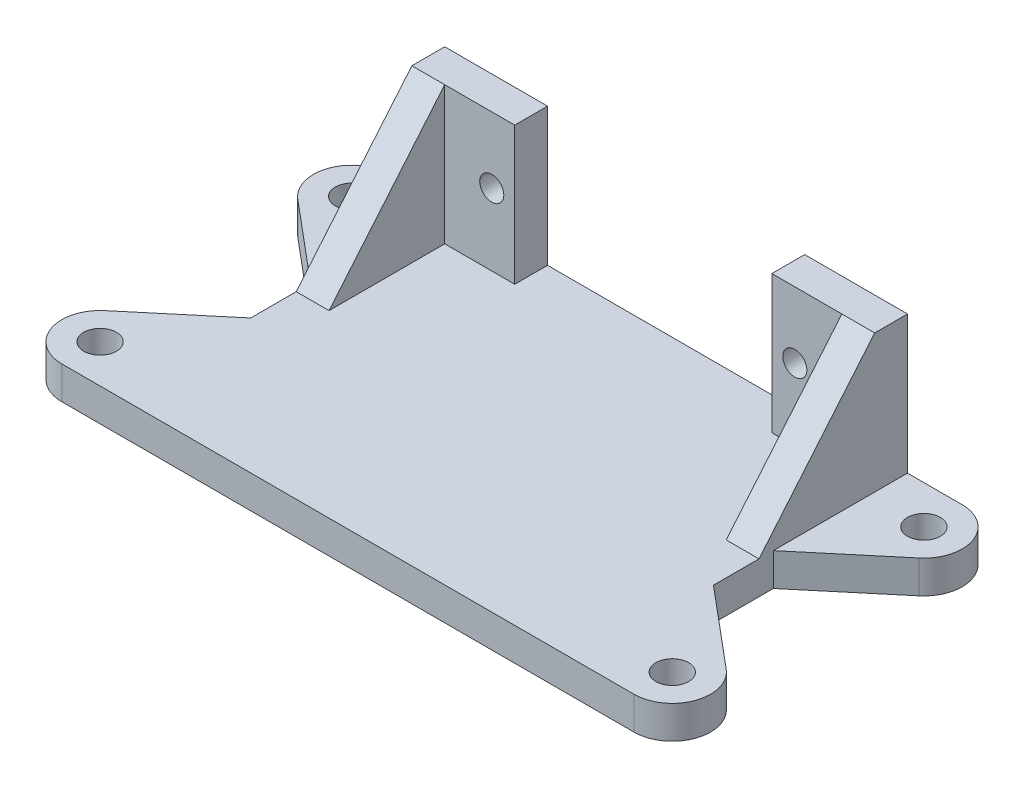
ISO-10303-21;
HEADER;
FILE_DESCRIPTION(('STEP AP214'),'2;1');
FILE_NAME('part.step','',(''),(''),'','','');
FILE_SCHEMA(('AUTOMOTIVE_DESIGN { 1 0 10303 214 1 1 1 1 }'));
ENDSEC;
DATA;
#1=APPLICATION_CONTEXT('core data for automotive mechanical design processes');
#2=APPLICATION_PROTOCOL_DEFINITION('international standard','automotive_design',2000,#1);
#3=PRODUCT_CONTEXT('',#1,'mechanical');
#4=PRODUCT('Part','Part','',(#3));
#5=PRODUCT_RELATED_PRODUCT_CATEGORY('part','',(#4));
#6=PRODUCT_DEFINITION_FORMATION('','',#4);
#7=PRODUCT_DEFINITION_CONTEXT('part definition',#1,'design');
#8=PRODUCT_DEFINITION('design','',#6,#7);
#9=PRODUCT_DEFINITION_SHAPE('','',#8);
#10=(LENGTH_UNIT() NAMED_UNIT(*) SI_UNIT(.MILLI.,.METRE.));
#11=(NAMED_UNIT(*) PLANE_ANGLE_UNIT() SI_UNIT($,.RADIAN.));
#12=(NAMED_UNIT(*) SI_UNIT($,.STERADIAN.) SOLID_ANGLE_UNIT());
#13=UNCERTAINTY_MEASURE_WITH_UNIT(LENGTH_MEASURE(1.E-05),#10,'distance_accuracy_value','');
#14=(GEOMETRIC_REPRESENTATION_CONTEXT(3) GLOBAL_UNCERTAINTY_ASSIGNED_CONTEXT((#13)) GLOBAL_UNIT_ASSIGNED_CONTEXT((#10,
#11,#12)) REPRESENTATION_CONTEXT('',''));
#15=CARTESIAN_POINT('',(0.,0.,0.));
#16=DIRECTION('',(0.,0.,1.));
#17=DIRECTION('',(1.,0.,0.));
#18=AXIS2_PLACEMENT_3D('',#15,#16,#17);
#19=CARTESIAN_POINT('',(21.15,15.6,3.));
#20=DIRECTION('',(1.,0.,0.));
#21=DIRECTION('',(0.,1.,0.));
#22=AXIS2_PLACEMENT_3D('',#19,#20,#21);
#23=PLANE('',#22);
#24=DIRECTION('',(0.,-1.,0.));
#25=VECTOR('',#24,1.);
#26=CARTESIAN_POINT('',(21.15,17.9220001314058,12.2644236685494));
#27=LINE('',#26,#25);
#28=CARTESIAN_POINT('',(21.15,2.99999999999999,12.2644236685494));
#29=VERTEX_POINT('',#28);
#30=CARTESIAN_POINT('',(21.15,0.,12.2644236685494));
#31=VERTEX_POINT('',#30);
#32=EDGE_CURVE('E203',#29,#31,#27,.T.);
#33=ORIENTED_EDGE('',*,*,#32,.F.);
#34=DIRECTION('',(0.,0.,-1.));
#35=VECTOR('',#34,1.);
#36=CARTESIAN_POINT('',(21.15,2.99999999999999,0.));
#37=LINE('',#36,#35);
#38=CARTESIAN_POINT('',(21.15,2.99999999999999,0.));
#39=VERTEX_POINT('',#38);
#40=EDGE_CURVE('E225',#29,#39,#37,.T.);
#41=ORIENTED_EDGE('',*,*,#40,.T.);
#42=DIRECTION('',(0.,-1.,0.));
#43=VECTOR('',#42,1.);
#44=CARTESIAN_POINT('',(21.15,15.6,0.));
#45=LINE('',#44,#43);
#46=CARTESIAN_POINT('',(21.15,15.6,0.));
#47=VERTEX_POINT('',#46);
#48=EDGE_CURVE('E218',#47,#39,#45,.T.);
#49=ORIENTED_EDGE('',*,*,#48,.F.);
#50=DIRECTION('',(0.,0.,-1.));
#51=VECTOR('',#50,1.);
#52=CARTESIAN_POINT('',(21.15,15.6,3.));
#53=LINE('',#52,#51);
#54=CARTESIAN_POINT('',(21.15,15.6,3.));
#55=VERTEX_POINT('',#54);
#56=EDGE_CURVE('E38',#55,#47,#53,.T.);
#57=ORIENTED_EDGE('',*,*,#56,.F.);
#58=DIRECTION('',(0.,-0.766044443118982,0.642787609686535));
#59=VECTOR('',#58,1.);
#60=CARTESIAN_POINT('',(21.15,15.6,3.));
#61=LINE('',#60,#59);
#62=CARTESIAN_POINT('',(21.15,2.99999999999999,13.5726553528336));
#63=VERTEX_POINT('',#62);
#64=EDGE_CURVE('E318',#55,#63,#61,.T.);
#65=ORIENTED_EDGE('',*,*,#64,.T.);
#66=DIRECTION('',(0.,0.,1.));
#67=VECTOR('',#66,1.);
#68=CARTESIAN_POINT('',(21.15,2.99999999999999,0.));
#69=LINE('',#68,#67);
#70=CARTESIAN_POINT('',(21.15,2.99999999999999,17.7355763314506));
#71=VERTEX_POINT('',#70);
#72=EDGE_CURVE('E348',#63,#71,#69,.T.);
#73=ORIENTED_EDGE('',*,*,#72,.T.);
#74=DIRECTION('',(0.,-1.,0.));
#75=VECTOR('',#74,1.);
#76=CARTESIAN_POINT('',(21.15,17.9220001314058,17.7355763314506));
#77=LINE('',#76,#75);
#78=CARTESIAN_POINT('',(21.15,0.,17.7355763314506));
#79=VERTEX_POINT('',#78);
#80=EDGE_CURVE('E243',#71,#79,#77,.T.);
#81=ORIENTED_EDGE('',*,*,#80,.T.);
#82=DIRECTION('',(0.,0.,-1.));
#83=VECTOR('',#82,1.);
#84=CARTESIAN_POINT('',(21.15,0.,3.));
#85=LINE('',#84,#83);
#86=EDGE_CURVE('E401',#79,#31,#85,.T.);
#87=ORIENTED_EDGE('',*,*,#86,.T.);
#88=EDGE_LOOP('',(#33,#41,#49,#57,#65,#73,#81,#87));
#89=FACE_BOUND('',#88,.T.);
#90=ADVANCED_FACE('F34',(#89),#23,.T.);
#91=CARTESIAN_POINT('',(-21.15,0.,3.));
#92=DIRECTION('',(-1.,0.,0.));
#93=DIRECTION('',(0.,-1.,0.));
#94=AXIS2_PLACEMENT_3D('',#91,#92,#93);
#95=PLANE('',#94);
#96=DIRECTION('',(0.,0.,-1.));
#97=VECTOR('',#96,1.);
#98=CARTESIAN_POINT('',(-21.15,2.99999999999999,0.));
#99=LINE('',#98,#97);
#100=CARTESIAN_POINT('',(-21.15,2.99999999999999,12.2644236685494));
#101=VERTEX_POINT('',#100);
#102=CARTESIAN_POINT('',(-21.15,2.99999999999999,0.));
#103=VERTEX_POINT('',#102);
#104=EDGE_CURVE('E59',#101,#103,#99,.T.);
#105=ORIENTED_EDGE('',*,*,#104,.F.);
#106=DIRECTION('',(0.,-1.,0.));
#107=VECTOR('',#106,1.);
#108=CARTESIAN_POINT('',(-21.15,17.9220001314058,12.2644236685494));
#109=LINE('',#108,#107);
#110=CARTESIAN_POINT('',(-21.15,0.,12.2644236685494));
#111=VERTEX_POINT('',#110);
#112=EDGE_CURVE('E269',#101,#111,#109,.T.);
#113=ORIENTED_EDGE('',*,*,#112,.T.);
#114=DIRECTION('',(0.,0.,-1.));
#115=VECTOR('',#114,1.);
#116=CARTESIAN_POINT('',(-21.15,0.,3.));
#117=LINE('',#116,#115);
#118=CARTESIAN_POINT('',(-21.15,0.,17.7355763314506));
#119=VERTEX_POINT('',#118);
#120=EDGE_CURVE('E399',#119,#111,#117,.T.);
#121=ORIENTED_EDGE('',*,*,#120,.F.);
#122=DIRECTION('',(0.,-1.,0.));
#123=VECTOR('',#122,1.);
#124=CARTESIAN_POINT('',(-21.15,17.9220001314058,17.7355763314506));
#125=LINE('',#124,#123);
#126=CARTESIAN_POINT('',(-21.15,2.99999999999999,17.7355763314506));
#127=VERTEX_POINT('',#126);
#128=EDGE_CURVE('E296',#127,#119,#125,.T.);
#129=ORIENTED_EDGE('',*,*,#128,.F.);
#130=DIRECTION('',(0.,0.,-1.));
#131=VECTOR('',#130,1.);
#132=CARTESIAN_POINT('',(-21.15,2.99999999999999,0.));
#133=LINE('',#132,#131);
#134=CARTESIAN_POINT('',(-21.15,2.99999999999999,13.5726553528336));
#135=VERTEX_POINT('',#134);
#136=EDGE_CURVE('E349',#127,#135,#133,.T.);
#137=ORIENTED_EDGE('',*,*,#136,.T.);
#138=DIRECTION('',(0.,-0.766044443118982,0.642787609686535));
#139=VECTOR('',#138,1.);
#140=CARTESIAN_POINT('',(-21.15,15.6,3.));
#141=LINE('',#140,#139);
#142=CARTESIAN_POINT('',(-21.15,15.6,3.));
#143=VERTEX_POINT('',#142);
#144=EDGE_CURVE('E293',#143,#135,#141,.T.);
#145=ORIENTED_EDGE('',*,*,#144,.F.);
#146=DIRECTION('',(0.,0.,-1.));
#147=VECTOR('',#146,1.);
#148=CARTESIAN_POINT('',(-21.15,15.6,3.));
#149=LINE('',#148,#147);
#150=CARTESIAN_POINT('',(-21.15,15.6,0.));
#151=VERTEX_POINT('',#150);
#152=EDGE_CURVE('E396',#143,#151,#149,.T.);
#153=ORIENTED_EDGE('',*,*,#152,.T.);
#154=DIRECTION('',(0.,1.,0.));
#155=VECTOR('',#154,1.);
#156=CARTESIAN_POINT('',(-21.15,0.,0.));
#157=LINE('',#156,#155);
#158=EDGE_CURVE('E378',#103,#151,#157,.T.);
#159=ORIENTED_EDGE('',*,*,#158,.F.);
#160=EDGE_LOOP('',(#105,#113,#121,#129,#137,#145,#153,#159));
#161=FACE_BOUND('',#160,.T.);
#162=ADVANCED_FACE('F463',(#161),#95,.T.);
#163=CARTESIAN_POINT('',(-11.75,2.99999999999999,3.));
#164=DIRECTION('',(0.,1.,0.));
#165=DIRECTION('',(0.,0.,1.));
#166=AXIS2_PLACEMENT_3D('',#163,#164,#165);
#167=PLANE('',#166);
#168=DIRECTION('',(0.,0.,-1.));
#169=VECTOR('',#168,1.);
#170=CARTESIAN_POINT('',(-18.15,2.99999999999999,13.5726553528336));
#171=LINE('',#170,#169);
#172=CARTESIAN_POINT('',(-18.15,2.99999999999999,13.5726553528336));
#173=VERTEX_POINT('',#172);
#174=CARTESIAN_POINT('',(-18.15,2.99999999999999,3.));
#175=VERTEX_POINT('',#174);
#176=EDGE_CURVE('E309',#173,#175,#171,.T.);
#177=ORIENTED_EDGE('',*,*,#176,.F.);
#178=DIRECTION('',(-1.,0.,0.));
#179=VECTOR('',#178,1.);
#180=CARTESIAN_POINT('',(-18.15,2.99999999999999,13.5726553528336));
#181=LINE('',#180,#179);
#182=EDGE_CURVE('E313',#173,#135,#181,.T.);
#183=ORIENTED_EDGE('',*,*,#182,.T.);
#184=ORIENTED_EDGE('',*,*,#136,.F.);
#185=DIRECTION('',(0.76604444311898,0.,-0.642787609686538));
#186=VECTOR('',#185,1.);
#187=CARTESIAN_POINT('',(-28.3997566339029,2.99999999999999,23.8188444490836));
#188=LINE('',#187,#186);
#189=CARTESIAN_POINT('',(-28.3997566339029,2.99999999999999,23.8188444490836));
#190=VERTEX_POINT('',#189);
#191=EDGE_CURVE('E273',#190,#127,#188,.T.);
#192=ORIENTED_EDGE('',*,*,#191,.F.);
#193=CARTESIAN_POINT('',(-26.15,2.99999999999999,26.5));
#194=DIRECTION('',(0.,1.,0.));
#195=DIRECTION('',(0.,0.,1.));
#196=AXIS2_PLACEMENT_3D('',#193,#194,#195);
#197=CIRCLE('',#196,3.5);
#198=CARTESIAN_POINT('',(-26.15,2.99999999999999,30.));
#199=VERTEX_POINT('',#198);
#200=EDGE_CURVE('E297',#199,#190,#197,.F.);
#201=ORIENTED_EDGE('',*,*,#200,.F.);
#202=DIRECTION('',(-1.,0.,0.));
#203=VECTOR('',#202,1.);
#204=CARTESIAN_POINT('',(-21.15,2.99999999999999,30.));
#205=LINE('',#204,#203);
#206=CARTESIAN_POINT('',(26.15,2.99999999999999,30.));
#207=VERTEX_POINT('',#206);
#208=EDGE_CURVE('E352',#207,#199,#205,.T.);
#209=ORIENTED_EDGE('',*,*,#208,.F.);
#210=CARTESIAN_POINT('',(26.15,2.99999999999999,26.5));
#211=DIRECTION('',(0.,1.,0.));
#212=DIRECTION('',(0.,0.,1.));
#213=AXIS2_PLACEMENT_3D('',#210,#211,#212);
#214=CIRCLE('',#213,3.5);
#215=CARTESIAN_POINT('',(28.3997566339029,2.99999999999999,23.8188444490836));
#216=VERTEX_POINT('',#215);
#217=EDGE_CURVE('E232',#207,#216,#214,.T.);
#218=ORIENTED_EDGE('',*,*,#217,.T.);
#219=DIRECTION('',(-0.76604444311898,0.,-0.642787609686538));
#220=VECTOR('',#219,1.);
#221=CARTESIAN_POINT('',(28.3997566339029,2.99999999999999,23.8188444490836));
#222=LINE('',#221,#220);
#223=EDGE_CURVE('E229',#216,#71,#222,.T.);
#224=ORIENTED_EDGE('',*,*,#223,.T.);
#225=ORIENTED_EDGE('',*,*,#72,.F.);
#226=DIRECTION('',(1.,0.,0.));
#227=VECTOR('',#226,1.);
#228=CARTESIAN_POINT('',(18.15,2.99999999999999,13.5726553528336));
#229=LINE('',#228,#227);
#230=CARTESIAN_POINT('',(18.15,2.99999999999999,13.5726553528336));
#231=VERTEX_POINT('',#230);
#232=EDGE_CURVE('E330',#231,#63,#229,.T.);
#233=ORIENTED_EDGE('',*,*,#232,.F.);
#234=DIRECTION('',(0.,0.,-1.));
#235=VECTOR('',#234,1.);
#236=CARTESIAN_POINT('',(18.15,2.99999999999999,13.5726553528336));
#237=LINE('',#236,#235);
#238=CARTESIAN_POINT('',(18.15,2.99999999999999,3.));
#239=VERTEX_POINT('',#238);
#240=EDGE_CURVE('E324',#231,#239,#237,.T.);
#241=ORIENTED_EDGE('',*,*,#240,.T.);
#242=DIRECTION('',(1.,0.,0.));
#243=VECTOR('',#242,1.);
#244=CARTESIAN_POINT('',(0.,2.99999999999999,3.));
#245=LINE('',#244,#243);
#246=CARTESIAN_POINT('',(11.75,2.99999999999999,3.));
#247=VERTEX_POINT('',#246);
#248=EDGE_CURVE('E351',#247,#239,#245,.T.);
#249=ORIENTED_EDGE('',*,*,#248,.F.);
#250=DIRECTION('',(0.,0.,-1.));
#251=VECTOR('',#250,1.);
#252=CARTESIAN_POINT('',(11.75,2.99999999999999,3.));
#253=LINE('',#252,#251);
#254=CARTESIAN_POINT('',(11.75,2.99999999999999,0.));
#255=VERTEX_POINT('',#254);
#256=EDGE_CURVE('E43',#247,#255,#253,.T.);
#257=ORIENTED_EDGE('',*,*,#256,.T.);
#258=DIRECTION('',(1.,0.,0.));
#259=VECTOR('',#258,1.);
#260=CARTESIAN_POINT('',(-11.75,2.99999999999999,0.));
#261=LINE('',#260,#259);
#262=CARTESIAN_POINT('',(-11.75,2.99999999999999,0.));
#263=VERTEX_POINT('',#262);
#264=EDGE_CURVE('E386',#263,#255,#261,.T.);
#265=ORIENTED_EDGE('',*,*,#264,.F.);
#266=DIRECTION('',(0.,0.,-1.));
#267=VECTOR('',#266,1.);
#268=CARTESIAN_POINT('',(-11.75,2.99999999999999,3.));
#269=LINE('',#268,#267);
#270=CARTESIAN_POINT('',(-11.75,2.99999999999999,3.));
#271=VERTEX_POINT('',#270);
#272=EDGE_CURVE('E392',#271,#263,#269,.T.);
#273=ORIENTED_EDGE('',*,*,#272,.F.);
#274=EDGE_CURVE('E358',#175,#271,#245,.T.);
#275=ORIENTED_EDGE('',*,*,#274,.F.);
#276=EDGE_LOOP('',(#177,#183,#184,#192,#201,#209,#218,#224,#225,#233,#241,#249,#257,#265,#273,#275));
#277=FACE_BOUND('',#276,.T.);
#278=CARTESIAN_POINT('',(-26.15,2.99999999999999,26.5));
#279=DIRECTION('',(0.,1.,0.));
#280=DIRECTION('',(0.,0.,1.));
#281=AXIS2_PLACEMENT_3D('',#278,#279,#280);
#282=CIRCLE('',#281,1.5);
#283=CARTESIAN_POINT('',(-26.15,2.99999999999999,28.));
#284=VERTEX_POINT('',#283);
#285=EDGE_CURVE('E283',#284,#284,#282,.F.);
#286=ORIENTED_EDGE('',*,*,#285,.T.);
#287=EDGE_LOOP('',(#286));
#288=FACE_BOUND('',#287,.T.);
#289=CARTESIAN_POINT('',(26.15,2.99999999999999,26.5));
#290=DIRECTION('',(0.,1.,0.));
#291=DIRECTION('',(0.,0.,1.));
#292=AXIS2_PLACEMENT_3D('',#289,#290,#291);
#293=CIRCLE('',#292,1.5);
#294=CARTESIAN_POINT('',(26.15,2.99999999999999,28.));
#295=VERTEX_POINT('',#294);
#296=EDGE_CURVE('E233',#295,#295,#293,.T.);
#297=ORIENTED_EDGE('',*,*,#296,.F.);
#298=EDGE_LOOP('',(#297));
#299=FACE_BOUND('',#298,.T.);
#300=ADVANCED_FACE('F425',(#277,#288,#299),#167,.T.);
#301=CARTESIAN_POINT('',(0.,0.,3.));
#302=DIRECTION('',(0.,0.,-1.));
#303=DIRECTION('',(-1.,0.,0.));
#304=AXIS2_PLACEMENT_3D('',#301,#302,#303);
#305=PLANE('',#304);
#306=CARTESIAN_POINT('',(-13.85,9.54999999999999,3.));
#307=DIRECTION('',(0.,0.,1.));
#308=DIRECTION('',(1.,0.,0.));
#309=AXIS2_PLACEMENT_3D('',#306,#307,#308);
#310=CIRCLE('',#309,1.1);
#311=CARTESIAN_POINT('',(-12.75,9.54999999999999,3.));
#312=VERTEX_POINT('',#311);
#313=EDGE_CURVE('E332',#312,#312,#310,.T.);
#314=ORIENTED_EDGE('',*,*,#313,.F.);
#315=EDGE_LOOP('',(#314));
#316=FACE_BOUND('',#315,.T.);
#317=DIRECTION('',(1.,0.,0.));
#318=VECTOR('',#317,1.);
#319=CARTESIAN_POINT('',(-21.15,15.6,3.));
#320=LINE('',#319,#318);
#321=CARTESIAN_POINT('',(-18.15,15.6,3.));
#322=VERTEX_POINT('',#321);
#323=CARTESIAN_POINT('',(-11.75,15.6,3.));
#324=VERTEX_POINT('',#323);
#325=EDGE_CURVE('E362',#322,#324,#320,.T.);
#326=ORIENTED_EDGE('',*,*,#325,.F.);
#327=DIRECTION('',(0.,1.,0.));
#328=VECTOR('',#327,1.);
#329=CARTESIAN_POINT('',(-18.15,2.99999999999999,3.));
#330=LINE('',#329,#328);
#331=EDGE_CURVE('E306',#175,#322,#330,.T.);
#332=ORIENTED_EDGE('',*,*,#331,.F.);
#333=ORIENTED_EDGE('',*,*,#274,.T.);
#334=DIRECTION('',(0.,-1.,0.));
#335=VECTOR('',#334,1.);
#336=CARTESIAN_POINT('',(-11.75,15.6,3.));
#337=LINE('',#336,#335);
#338=EDGE_CURVE('E367',#324,#271,#337,.T.);
#339=ORIENTED_EDGE('',*,*,#338,.F.);
#340=EDGE_LOOP('',(#326,#332,#333,#339));
#341=FACE_BOUND('',#340,.T.);
#342=ADVANCED_FACE('F457',(#316,#341),#305,.F.);
#343=CARTESIAN_POINT('',(11.75,15.6,3.));
#344=DIRECTION('',(0.,1.,0.));
#345=DIRECTION('',(0.,0.,1.));
#346=AXIS2_PLACEMENT_3D('',#343,#344,#345);
#347=PLANE('',#346);
#348=DIRECTION('',(1.,0.,0.));
#349=VECTOR('',#348,1.);
#350=CARTESIAN_POINT('',(11.75,15.6,0.));
#351=LINE('',#350,#349);
#352=CARTESIAN_POINT('',(11.75,15.6,0.));
#353=VERTEX_POINT('',#352);
#354=EDGE_CURVE('E373',#353,#47,#351,.T.);
#355=ORIENTED_EDGE('',*,*,#354,.F.);
#356=DIRECTION('',(0.,0.,-1.));
#357=VECTOR('',#356,1.);
#358=CARTESIAN_POINT('',(11.75,15.6,3.));
#359=LINE('',#358,#357);
#360=CARTESIAN_POINT('',(11.75,15.6,3.));
#361=VERTEX_POINT('',#360);
#362=EDGE_CURVE('E11',#361,#353,#359,.T.);
#363=ORIENTED_EDGE('',*,*,#362,.F.);
#364=DIRECTION('',(1.,0.,0.));
#365=VECTOR('',#364,1.);
#366=CARTESIAN_POINT('',(11.75,15.6,3.));
#367=LINE('',#366,#365);
#368=CARTESIAN_POINT('',(18.15,15.6,3.));
#369=VERTEX_POINT('',#368);
#370=EDGE_CURVE('E359',#361,#369,#367,.T.);
#371=ORIENTED_EDGE('',*,*,#370,.T.);
#372=DIRECTION('',(1.,0.,0.));
#373=VECTOR('',#372,1.);
#374=CARTESIAN_POINT('',(18.15,15.6,3.));
#375=LINE('',#374,#373);
#376=EDGE_CURVE('E327',#369,#55,#375,.T.);
#377=ORIENTED_EDGE('',*,*,#376,.T.);
#378=ORIENTED_EDGE('',*,*,#56,.T.);
#379=EDGE_LOOP('',(#355,#363,#371,#377,#378));
#380=FACE_BOUND('',#379,.T.);
#381=ADVANCED_FACE('F36',(#380),#347,.T.);
#382=CARTESIAN_POINT('',(11.75,2.99999999999999,3.));
#383=DIRECTION('',(-1.,0.,0.));
#384=DIRECTION('',(0.,0.,1.));
#385=AXIS2_PLACEMENT_3D('',#382,#383,#384);
#386=PLANE('',#385);
#387=DIRECTION('',(0.,1.,0.));
#388=VECTOR('',#387,1.);
#389=CARTESIAN_POINT('',(11.75,2.99999999999999,0.));
#390=LINE('',#389,#388);
#391=EDGE_CURVE('E363',#255,#353,#390,.T.);
#392=ORIENTED_EDGE('',*,*,#391,.F.);
#393=ORIENTED_EDGE('',*,*,#256,.F.);
#394=DIRECTION('',(0.,1.,0.));
#395=VECTOR('',#394,1.);
#396=CARTESIAN_POINT('',(11.75,2.99999999999999,3.));
#397=LINE('',#396,#395);
#398=EDGE_CURVE('E370',#247,#361,#397,.T.);
#399=ORIENTED_EDGE('',*,*,#398,.T.);
#400=ORIENTED_EDGE('',*,*,#362,.T.);
#401=EDGE_LOOP('',(#392,#393,#399,#400));
#402=FACE_BOUND('',#401,.T.);
#403=ADVANCED_FACE('F413',(#402),#386,.T.);
#404=CARTESIAN_POINT('',(-11.75,15.6,3.));
#405=DIRECTION('',(1.,0.,0.));
#406=DIRECTION('',(0.,0.,-1.));
#407=AXIS2_PLACEMENT_3D('',#404,#405,#406);
#408=PLANE('',#407);
#409=DIRECTION('',(0.,-1.,0.));
#410=VECTOR('',#409,1.);
#411=CARTESIAN_POINT('',(-11.75,15.6,0.));
#412=LINE('',#411,#410);
#413=CARTESIAN_POINT('',(-11.75,15.6,0.));
#414=VERTEX_POINT('',#413);
#415=EDGE_CURVE('E383',#414,#263,#412,.T.);
#416=ORIENTED_EDGE('',*,*,#415,.F.);
#417=DIRECTION('',(0.,0.,-1.));
#418=VECTOR('',#417,1.);
#419=CARTESIAN_POINT('',(-11.75,15.6,3.));
#420=LINE('',#419,#418);
#421=EDGE_CURVE('E394',#324,#414,#420,.T.);
#422=ORIENTED_EDGE('',*,*,#421,.F.);
#423=ORIENTED_EDGE('',*,*,#338,.T.);
#424=ORIENTED_EDGE('',*,*,#272,.T.);
#425=EDGE_LOOP('',(#416,#422,#423,#424));
#426=FACE_BOUND('',#425,.T.);
#427=ADVANCED_FACE('F458',(#426),#408,.T.);
#428=CARTESIAN_POINT('',(-21.15,15.6,3.));
#429=DIRECTION('',(0.,1.,0.));
#430=DIRECTION('',(0.,0.,1.));
#431=AXIS2_PLACEMENT_3D('',#428,#429,#430);
#432=PLANE('',#431);
#433=DIRECTION('',(1.,0.,0.));
#434=VECTOR('',#433,1.);
#435=CARTESIAN_POINT('',(-21.15,15.6,0.));
#436=LINE('',#435,#434);
#437=EDGE_CURVE('E380',#151,#414,#436,.T.);
#438=ORIENTED_EDGE('',*,*,#437,.F.);
#439=ORIENTED_EDGE('',*,*,#152,.F.);
#440=EDGE_CURVE('E364',#143,#322,#320,.T.);
#441=ORIENTED_EDGE('',*,*,#440,.T.);
#442=ORIENTED_EDGE('',*,*,#325,.T.);
#443=ORIENTED_EDGE('',*,*,#421,.T.);
#444=EDGE_LOOP('',(#438,#439,#441,#442,#443));
#445=FACE_BOUND('',#444,.T.);
#446=ADVANCED_FACE('F449',(#445),#432,.T.);
#447=CARTESIAN_POINT('',(21.15,0.,3.));
#448=DIRECTION('',(0.,-1.,0.));
#449=DIRECTION('',(0.,0.,-1.));
#450=AXIS2_PLACEMENT_3D('',#447,#448,#449);
#451=PLANE('',#450);
#452=DIRECTION('',(-1.,0.,0.));
#453=VECTOR('',#452,1.);
#454=CARTESIAN_POINT('',(21.15,0.,0.));
#455=LINE('',#454,#453);
#456=CARTESIAN_POINT('',(26.15,0.,0.));
#457=VERTEX_POINT('',#456);
#458=CARTESIAN_POINT('',(-26.15,0.,0.));
#459=VERTEX_POINT('',#458);
#460=EDGE_CURVE('E376',#457,#459,#455,.T.);
#461=ORIENTED_EDGE('',*,*,#460,.F.);
#462=CARTESIAN_POINT('',(26.15,0.,3.5));
#463=DIRECTION('',(0.,-1.,0.));
#464=DIRECTION('',(0.,0.,1.));
#465=AXIS2_PLACEMENT_3D('',#462,#463,#464);
#466=CIRCLE('',#465,3.5);
#467=CARTESIAN_POINT('',(28.3997566339029,0.,6.18115555091643));
#468=VERTEX_POINT('',#467);
#469=EDGE_CURVE('E210',#457,#468,#466,.T.);
#470=ORIENTED_EDGE('',*,*,#469,.T.);
#471=DIRECTION('',(-0.76604444311898,0.,0.642787609686538));
#472=VECTOR('',#471,1.);
#473=CARTESIAN_POINT('',(28.3997566339029,0.,6.18115555091643));
#474=LINE('',#473,#472);
#475=EDGE_CURVE('E437',#468,#31,#474,.T.);
#476=ORIENTED_EDGE('',*,*,#475,.T.);
#477=ORIENTED_EDGE('',*,*,#86,.F.);
#478=DIRECTION('',(-0.76604444311898,0.,-0.642787609686538));
#479=VECTOR('',#478,1.);
#480=CARTESIAN_POINT('',(28.3997566339029,0.,23.8188444490836));
#481=LINE('',#480,#479);
#482=CARTESIAN_POINT('',(28.3997566339029,0.,23.8188444490836));
#483=VERTEX_POINT('',#482);
#484=EDGE_CURVE('E51',#483,#79,#481,.T.);
#485=ORIENTED_EDGE('',*,*,#484,.F.);
#486=CARTESIAN_POINT('',(26.15,0.,26.5));
#487=DIRECTION('',(0.,1.,0.));
#488=DIRECTION('',(0.,0.,-1.));
#489=AXIS2_PLACEMENT_3D('',#486,#487,#488);
#490=CIRCLE('',#489,3.5);
#491=CARTESIAN_POINT('',(26.15,0.,30.));
#492=VERTEX_POINT('',#491);
#493=EDGE_CURVE('E240',#492,#483,#490,.T.);
#494=ORIENTED_EDGE('',*,*,#493,.F.);
#495=DIRECTION('',(-1.,0.,0.));
#496=VECTOR('',#495,1.);
#497=CARTESIAN_POINT('',(-21.15,0.,30.));
#498=LINE('',#497,#496);
#499=CARTESIAN_POINT('',(-26.15,0.,30.));
#500=VERTEX_POINT('',#499);
#501=EDGE_CURVE('E338',#492,#500,#498,.T.);
#502=ORIENTED_EDGE('',*,*,#501,.T.);
#503=CARTESIAN_POINT('',(-26.15,0.,26.5));
#504=DIRECTION('',(0.,-1.,0.));
#505=DIRECTION('',(0.,0.,-1.));
#506=AXIS2_PLACEMENT_3D('',#503,#504,#505);
#507=CIRCLE('',#506,3.5);
#508=CARTESIAN_POINT('',(-28.3997566339029,0.,23.8188444490836));
#509=VERTEX_POINT('',#508);
#510=EDGE_CURVE('E284',#500,#509,#507,.T.);
#511=ORIENTED_EDGE('',*,*,#510,.T.);
#512=DIRECTION('',(0.76604444311898,0.,-0.642787609686538));
#513=VECTOR('',#512,1.);
#514=CARTESIAN_POINT('',(-28.3997566339029,0.,23.8188444490836));
#515=LINE('',#514,#513);
#516=EDGE_CURVE('E280',#509,#119,#515,.T.);
#517=ORIENTED_EDGE('',*,*,#516,.T.);
#518=ORIENTED_EDGE('',*,*,#120,.T.);
#519=DIRECTION('',(0.76604444311898,0.,0.642787609686538));
#520=VECTOR('',#519,1.);
#521=CARTESIAN_POINT('',(-28.3997566339029,0.,6.18115555091643));
#522=LINE('',#521,#520);
#523=CARTESIAN_POINT('',(-28.3997566339029,0.,6.18115555091643));
#524=VERTEX_POINT('',#523);
#525=EDGE_CURVE('E264',#524,#111,#522,.T.);
#526=ORIENTED_EDGE('',*,*,#525,.F.);
#527=CARTESIAN_POINT('',(-26.15,0.,3.5));
#528=DIRECTION('',(0.,1.,0.));
#529=DIRECTION('',(0.,0.,1.));
#530=AXIS2_PLACEMENT_3D('',#527,#528,#529);
#531=CIRCLE('',#530,3.5);
#532=EDGE_CURVE('E266',#459,#524,#531,.T.);
#533=ORIENTED_EDGE('',*,*,#532,.F.);
#534=EDGE_LOOP('',(#461,#470,#476,#477,#485,#494,#502,#511,#517,#518,#526,#533));
#535=FACE_BOUND('',#534,.T.);
#536=CARTESIAN_POINT('',(-26.15,0.,26.5));
#537=DIRECTION('',(0.,-1.,0.));
#538=DIRECTION('',(0.,0.,-1.));
#539=AXIS2_PLACEMENT_3D('',#536,#537,#538);
#540=CIRCLE('',#539,1.5);
#541=CARTESIAN_POINT('',(-26.15,0.,25.));
#542=VERTEX_POINT('',#541);
#543=EDGE_CURVE('E287',#542,#542,#540,.T.);
#544=ORIENTED_EDGE('',*,*,#543,.F.);
#545=EDGE_LOOP('',(#544));
#546=FACE_BOUND('',#545,.T.);
#547=CARTESIAN_POINT('',(-26.15,0.,3.5));
#548=DIRECTION('',(0.,1.,0.));
#549=DIRECTION('',(0.,0.,1.));
#550=AXIS2_PLACEMENT_3D('',#547,#548,#549);
#551=CIRCLE('',#550,1.5);
#552=CARTESIAN_POINT('',(-26.15,0.,5.));
#553=VERTEX_POINT('',#552);
#554=EDGE_CURVE('E261',#553,#553,#551,.T.);
#555=ORIENTED_EDGE('',*,*,#554,.T.);
#556=EDGE_LOOP('',(#555));
#557=FACE_BOUND('',#556,.T.);
#558=CARTESIAN_POINT('',(26.15,0.,26.5));
#559=DIRECTION('',(0.,1.,0.));
#560=DIRECTION('',(0.,0.,-1.));
#561=AXIS2_PLACEMENT_3D('',#558,#559,#560);
#562=CIRCLE('',#561,1.5);
#563=CARTESIAN_POINT('',(26.15,0.,25.));
#564=VERTEX_POINT('',#563);
#565=EDGE_CURVE('E236',#564,#564,#562,.T.);
#566=ORIENTED_EDGE('',*,*,#565,.T.);
#567=EDGE_LOOP('',(#566));
#568=FACE_BOUND('',#567,.T.);
#569=CARTESIAN_POINT('',(26.15,0.,3.5));
#570=DIRECTION('',(0.,-1.,0.));
#571=DIRECTION('',(0.,0.,1.));
#572=AXIS2_PLACEMENT_3D('',#569,#570,#571);
#573=CIRCLE('',#572,1.5);
#574=CARTESIAN_POINT('',(26.15,0.,5.));
#575=VERTEX_POINT('',#574);
#576=EDGE_CURVE('E212',#575,#575,#573,.T.);
#577=ORIENTED_EDGE('',*,*,#576,.F.);
#578=EDGE_LOOP('',(#577));
#579=FACE_BOUND('',#578,.T.);
#580=ADVANCED_FACE('F433',(#535,#546,#557,#568,#579),#451,.T.);
#581=CARTESIAN_POINT('',(13.85,9.54999999999999,3.));
#582=DIRECTION('',(0.,0.,1.));
#583=DIRECTION('',(1.,0.,0.));
#584=AXIS2_PLACEMENT_3D('',#581,#582,#583);
#585=CIRCLE('',#584,1.1);
#586=CARTESIAN_POINT('',(14.95,9.54999999999999,3.));
#587=VERTEX_POINT('',#586);
#588=EDGE_CURVE('E339',#587,#587,#585,.T.);
#589=ORIENTED_EDGE('',*,*,#588,.F.);
#590=EDGE_LOOP('',(#589));
#591=FACE_BOUND('',#590,.T.);
#592=ORIENTED_EDGE('',*,*,#248,.T.);
#593=DIRECTION('',(0.,1.,0.));
#594=VECTOR('',#593,1.);
#595=CARTESIAN_POINT('',(18.15,2.99999999999999,3.));
#596=LINE('',#595,#594);
#597=EDGE_CURVE('E319',#239,#369,#596,.T.);
#598=ORIENTED_EDGE('',*,*,#597,.T.);
#599=ORIENTED_EDGE('',*,*,#370,.F.);
#600=ORIENTED_EDGE('',*,*,#398,.F.);
#601=EDGE_LOOP('',(#592,#598,#599,#600));
#602=FACE_BOUND('',#601,.T.);
#603=ADVANCED_FACE('F417',(#591,#602),#305,.F.);
#604=CARTESIAN_POINT('',(0.,0.,0.));
#605=DIRECTION('',(0.,0.,-1.));
#606=DIRECTION('',(-1.,0.,0.));
#607=AXIS2_PLACEMENT_3D('',#604,#605,#606);
#608=PLANE('',#607);
#609=CARTESIAN_POINT('',(13.85,9.54999999999999,0.));
#610=DIRECTION('',(0.,0.,1.));
#611=DIRECTION('',(1.,0.,0.));
#612=AXIS2_PLACEMENT_3D('',#609,#610,#611);
#613=CIRCLE('',#612,1.1);
#614=CARTESIAN_POINT('',(14.95,9.54999999999999,0.));
#615=VERTEX_POINT('',#614);
#616=EDGE_CURVE('E335',#615,#615,#613,.T.);
#617=ORIENTED_EDGE('',*,*,#616,.T.);
#618=EDGE_LOOP('',(#617));
#619=FACE_BOUND('',#618,.T.);
#620=CARTESIAN_POINT('',(-13.85,9.54999999999999,0.));
#621=DIRECTION('',(0.,0.,1.));
#622=DIRECTION('',(1.,0.,0.));
#623=AXIS2_PLACEMENT_3D('',#620,#621,#622);
#624=CIRCLE('',#623,1.1);
#625=CARTESIAN_POINT('',(-12.75,9.54999999999999,0.));
#626=VERTEX_POINT('',#625);
#627=EDGE_CURVE('E342',#626,#626,#624,.T.);
#628=ORIENTED_EDGE('',*,*,#627,.T.);
#629=EDGE_LOOP('',(#628));
#630=FACE_BOUND('',#629,.T.);
#631=ORIENTED_EDGE('',*,*,#48,.T.);
#632=DIRECTION('',(1.,0.,0.));
#633=VECTOR('',#632,1.);
#634=CARTESIAN_POINT('',(21.15,2.99999999999999,0.));
#635=LINE('',#634,#633);
#636=CARTESIAN_POINT('',(26.15,2.99999999999999,0.));
#637=VERTEX_POINT('',#636);
#638=EDGE_CURVE('E196',#39,#637,#635,.T.);
#639=ORIENTED_EDGE('',*,*,#638,.T.);
#640=DIRECTION('',(0.,-1.,0.));
#641=VECTOR('',#640,1.);
#642=CARTESIAN_POINT('',(26.15,17.9220001314058,0.));
#643=LINE('',#642,#641);
#644=EDGE_CURVE('E207',#637,#457,#643,.T.);
#645=ORIENTED_EDGE('',*,*,#644,.T.);
#646=ORIENTED_EDGE('',*,*,#460,.T.);
#647=DIRECTION('',(0.,-1.,0.));
#648=VECTOR('',#647,1.);
#649=CARTESIAN_POINT('',(-26.15,17.9220001314058,0.));
#650=LINE('',#649,#648);
#651=CARTESIAN_POINT('',(-26.15,2.99999999999999,0.));
#652=VERTEX_POINT('',#651);
#653=EDGE_CURVE('E270',#652,#459,#650,.T.);
#654=ORIENTED_EDGE('',*,*,#653,.F.);
#655=DIRECTION('',(-1.,0.,0.));
#656=VECTOR('',#655,1.);
#657=CARTESIAN_POINT('',(-21.15,2.99999999999999,0.));
#658=LINE('',#657,#656);
#659=EDGE_CURVE('E258',#103,#652,#658,.T.);
#660=ORIENTED_EDGE('',*,*,#659,.F.);
#661=ORIENTED_EDGE('',*,*,#158,.T.);
#662=ORIENTED_EDGE('',*,*,#437,.T.);
#663=ORIENTED_EDGE('',*,*,#415,.T.);
#664=ORIENTED_EDGE('',*,*,#264,.T.);
#665=ORIENTED_EDGE('',*,*,#391,.T.);
#666=ORIENTED_EDGE('',*,*,#354,.T.);
#667=EDGE_LOOP('',(#631,#639,#645,#646,#654,#660,#661,#662,#663,#664,#665,#666));
#668=FACE_BOUND('',#667,.T.);
#669=ADVANCED_FACE('F215',(#619,#630,#668),#608,.T.);
#670=CARTESIAN_POINT('',(-21.15,54.8583648026044,30.));
#671=DIRECTION('',(0.,0.,1.));
#672=DIRECTION('',(1.,0.,0.));
#673=AXIS2_PLACEMENT_3D('',#670,#671,#672);
#674=PLANE('',#673);
#675=ORIENTED_EDGE('',*,*,#501,.F.);
#676=DIRECTION('',(0.,-1.,0.));
#677=VECTOR('',#676,1.);
#678=CARTESIAN_POINT('',(26.15,17.9220001314058,30.));
#679=LINE('',#678,#677);
#680=EDGE_CURVE('E244',#207,#492,#679,.T.);
#681=ORIENTED_EDGE('',*,*,#680,.F.);
#682=ORIENTED_EDGE('',*,*,#208,.T.);
#683=DIRECTION('',(0.,-1.,0.));
#684=VECTOR('',#683,1.);
#685=CARTESIAN_POINT('',(-26.15,17.9220001314058,30.));
#686=LINE('',#685,#684);
#687=EDGE_CURVE('E290',#199,#500,#686,.T.);
#688=ORIENTED_EDGE('',*,*,#687,.T.);
#689=EDGE_LOOP('',(#675,#681,#682,#688));
#690=FACE_BOUND('',#689,.T.);
#691=ADVANCED_FACE('F479',(#690),#674,.T.);
#692=CARTESIAN_POINT('',(-13.85,9.54999999999999,0.));
#693=DIRECTION('',(0.,0.,1.));
#694=DIRECTION('',(1.,0.,0.));
#695=AXIS2_PLACEMENT_3D('',#692,#693,#694);
#696=CYLINDRICAL_SURFACE('',#695,1.1);
#697=ORIENTED_EDGE('',*,*,#627,.F.);
#698=EDGE_LOOP('',(#697));
#699=FACE_BOUND('',#698,.T.);
#700=ORIENTED_EDGE('',*,*,#313,.T.);
#701=EDGE_LOOP('',(#700));
#702=FACE_BOUND('',#701,.T.);
#703=ADVANCED_FACE('F484',(#699,#702),#696,.F.);
#704=CARTESIAN_POINT('',(13.85,9.54999999999999,0.));
#705=DIRECTION('',(0.,0.,1.));
#706=DIRECTION('',(1.,0.,0.));
#707=AXIS2_PLACEMENT_3D('',#704,#705,#706);
#708=CYLINDRICAL_SURFACE('',#707,1.1);
#709=ORIENTED_EDGE('',*,*,#616,.F.);
#710=EDGE_LOOP('',(#709));
#711=FACE_BOUND('',#710,.T.);
#712=ORIENTED_EDGE('',*,*,#588,.T.);
#713=EDGE_LOOP('',(#712));
#714=FACE_BOUND('',#713,.T.);
#715=ADVANCED_FACE('F488',(#711,#714),#708,.F.);
#716=CARTESIAN_POINT('',(18.15,15.6,3.));
#717=DIRECTION('',(0.,0.642787609686535,0.766044443118982));
#718=DIRECTION('',(0.,-0.766044443118982,0.642787609686535));
#719=AXIS2_PLACEMENT_3D('',#716,#717,#718);
#720=PLANE('',#719);
#721=ORIENTED_EDGE('',*,*,#64,.F.);
#722=ORIENTED_EDGE('',*,*,#376,.F.);
#723=DIRECTION('',(0.,-0.766044443118982,0.642787609686535));
#724=VECTOR('',#723,1.);
#725=CARTESIAN_POINT('',(18.15,15.6,3.));
#726=LINE('',#725,#724);
#727=EDGE_CURVE('E322',#369,#231,#726,.T.);
#728=ORIENTED_EDGE('',*,*,#727,.T.);
#729=ORIENTED_EDGE('',*,*,#232,.T.);
#730=EDGE_LOOP('',(#721,#722,#728,#729));
#731=FACE_BOUND('',#730,.T.);
#732=ADVANCED_FACE('F429',(#731),#720,.T.);
#733=CARTESIAN_POINT('',(18.15,0.,0.));
#734=DIRECTION('',(-1.,0.,0.));
#735=DIRECTION('',(0.,-1.,0.));
#736=AXIS2_PLACEMENT_3D('',#733,#734,#735);
#737=PLANE('',#736);
#738=ORIENTED_EDGE('',*,*,#597,.F.);
#739=ORIENTED_EDGE('',*,*,#240,.F.);
#740=ORIENTED_EDGE('',*,*,#727,.F.);
#741=EDGE_LOOP('',(#738,#739,#740));
#742=FACE_BOUND('',#741,.T.);
#743=ADVANCED_FACE('F421',(#742),#737,.T.);
#744=CARTESIAN_POINT('',(-18.15,15.6,3.));
#745=DIRECTION('',(0.,-0.642787609686535,-0.766044443118982));
#746=DIRECTION('',(0.,0.766044443118982,-0.642787609686535));
#747=AXIS2_PLACEMENT_3D('',#744,#745,#746);
#748=PLANE('',#747);
#749=ORIENTED_EDGE('',*,*,#144,.T.);
#750=ORIENTED_EDGE('',*,*,#182,.F.);
#751=DIRECTION('',(0.,-0.766044443118982,0.642787609686535));
#752=VECTOR('',#751,1.);
#753=CARTESIAN_POINT('',(-18.15,15.6,3.));
#754=LINE('',#753,#752);
#755=EDGE_CURVE('E311',#322,#173,#754,.T.);
#756=ORIENTED_EDGE('',*,*,#755,.F.);
#757=ORIENTED_EDGE('',*,*,#440,.F.);
#758=EDGE_LOOP('',(#749,#750,#756,#757));
#759=FACE_BOUND('',#758,.T.);
#760=ADVANCED_FACE('F497',(#759),#748,.F.);
#761=CARTESIAN_POINT('',(-18.15,0.,0.));
#762=DIRECTION('',(1.,0.,0.));
#763=DIRECTION('',(0.,-1.,0.));
#764=AXIS2_PLACEMENT_3D('',#761,#762,#763);
#765=PLANE('',#764);
#766=ORIENTED_EDGE('',*,*,#331,.T.);
#767=ORIENTED_EDGE('',*,*,#755,.T.);
#768=ORIENTED_EDGE('',*,*,#176,.T.);
#769=EDGE_LOOP('',(#766,#767,#768));
#770=FACE_BOUND('',#769,.T.);
#771=ADVANCED_FACE('F500',(#770),#765,.T.);
#772=CARTESIAN_POINT('',(-28.3997566339029,17.9220001314058,23.8188444490836));
#773=DIRECTION('',(-0.642787609686538,0.,-0.76604444311898));
#774=DIRECTION('',(-0.76604444311898,0.,0.642787609686538));
#775=AXIS2_PLACEMENT_3D('',#772,#773,#774);
#776=PLANE('',#775);
#777=DIRECTION('',(0.,-1.,0.));
#778=VECTOR('',#777,1.);
#779=CARTESIAN_POINT('',(-28.3997566339029,17.9220001314058,23.8188444490836));
#780=LINE('',#779,#778);
#781=EDGE_CURVE('E300',#190,#509,#780,.T.);
#782=ORIENTED_EDGE('',*,*,#781,.F.);
#783=ORIENTED_EDGE('',*,*,#191,.T.);
#784=ORIENTED_EDGE('',*,*,#128,.T.);
#785=ORIENTED_EDGE('',*,*,#516,.F.);
#786=EDGE_LOOP('',(#782,#783,#784,#785));
#787=FACE_BOUND('',#786,.T.);
#788=ADVANCED_FACE('F504',(#787),#776,.T.);
#789=CARTESIAN_POINT('',(-26.15,17.9220001314058,26.5));
#790=DIRECTION('',(0.,-1.,0.));
#791=DIRECTION('',(0.,0.,-1.));
#792=AXIS2_PLACEMENT_3D('',#789,#790,#791);
#793=CYLINDRICAL_SURFACE('',#792,3.5);
#794=ORIENTED_EDGE('',*,*,#687,.F.);
#795=ORIENTED_EDGE('',*,*,#200,.T.);
#796=ORIENTED_EDGE('',*,*,#781,.T.);
#797=ORIENTED_EDGE('',*,*,#510,.F.);
#798=EDGE_LOOP('',(#794,#795,#796,#797));
#799=FACE_BOUND('',#798,.T.);
#800=ADVANCED_FACE('F510',(#799),#793,.T.);
#801=CARTESIAN_POINT('',(-26.15,17.9220001314058,26.5));
#802=DIRECTION('',(0.,-1.,0.));
#803=DIRECTION('',(0.,0.,-1.));
#804=AXIS2_PLACEMENT_3D('',#801,#802,#803);
#805=CYLINDRICAL_SURFACE('',#804,1.5);
#806=ORIENTED_EDGE('',*,*,#543,.T.);
#807=EDGE_LOOP('',(#806));
#808=FACE_BOUND('',#807,.T.);
#809=ORIENTED_EDGE('',*,*,#285,.F.);
#810=EDGE_LOOP('',(#809));
#811=FACE_BOUND('',#810,.T.);
#812=ADVANCED_FACE('F506',(#808,#811),#805,.F.);
#813=CARTESIAN_POINT('',(-28.3997566339029,17.9220001314058,6.18115555091643));
#814=DIRECTION('',(0.642787609686538,0.,-0.76604444311898));
#815=DIRECTION('',(-0.76604444311898,0.,-0.642787609686538));
#816=AXIS2_PLACEMENT_3D('',#813,#814,#815);
#817=PLANE('',#816);
#818=DIRECTION('',(0.76604444311898,0.,0.642787609686538));
#819=VECTOR('',#818,1.);
#820=CARTESIAN_POINT('',(-28.3997566339029,2.99999999999999,6.18115555091643));
#821=LINE('',#820,#819);
#822=CARTESIAN_POINT('',(-28.3997566339029,2.99999999999999,6.18115555091643));
#823=VERTEX_POINT('',#822);
#824=EDGE_CURVE('E253',#823,#101,#821,.T.);
#825=ORIENTED_EDGE('',*,*,#824,.F.);
#826=DIRECTION('',(0.,-1.,0.));
#827=VECTOR('',#826,1.);
#828=CARTESIAN_POINT('',(-28.3997566339029,17.9220001314058,6.18115555091643));
#829=LINE('',#828,#827);
#830=EDGE_CURVE('E274',#823,#524,#829,.T.);
#831=ORIENTED_EDGE('',*,*,#830,.T.);
#832=ORIENTED_EDGE('',*,*,#525,.T.);
#833=ORIENTED_EDGE('',*,*,#112,.F.);
#834=EDGE_LOOP('',(#825,#831,#832,#833));
#835=FACE_BOUND('',#834,.T.);
#836=ADVANCED_FACE('F509',(#835),#817,.F.);
#837=CARTESIAN_POINT('',(-26.15,17.9220001314058,3.5));
#838=DIRECTION('',(0.,-1.,0.));
#839=DIRECTION('',(0.,0.,-1.));
#840=AXIS2_PLACEMENT_3D('',#837,#838,#839);
#841=CYLINDRICAL_SURFACE('',#840,3.5);
#842=CARTESIAN_POINT('',(-26.15,2.99999999999999,3.5));
#843=DIRECTION('',(0.,1.,0.));
#844=DIRECTION('',(0.,0.,1.));
#845=AXIS2_PLACEMENT_3D('',#842,#843,#844);
#846=CIRCLE('',#845,3.5);
#847=EDGE_CURVE('E255',#652,#823,#846,.T.);
#848=ORIENTED_EDGE('',*,*,#847,.F.);
#849=ORIENTED_EDGE('',*,*,#653,.T.);
#850=ORIENTED_EDGE('',*,*,#532,.T.);
#851=ORIENTED_EDGE('',*,*,#830,.F.);
#852=EDGE_LOOP('',(#848,#849,#850,#851));
#853=FACE_BOUND('',#852,.T.);
#854=ADVANCED_FACE('F520',(#853),#841,.T.);
#855=CARTESIAN_POINT('',(-26.15,17.9220001314058,3.5));
#856=DIRECTION('',(0.,-1.,0.));
#857=DIRECTION('',(0.,0.,-1.));
#858=AXIS2_PLACEMENT_3D('',#855,#856,#857);
#859=CYLINDRICAL_SURFACE('',#858,1.5);
#860=ORIENTED_EDGE('',*,*,#554,.F.);
#861=EDGE_LOOP('',(#860));
#862=FACE_BOUND('',#861,.T.);
#863=CARTESIAN_POINT('',(-26.15,2.99999999999999,3.5));
#864=DIRECTION('',(0.,1.,0.));
#865=DIRECTION('',(0.,0.,1.));
#866=AXIS2_PLACEMENT_3D('',#863,#864,#865);
#867=CIRCLE('',#866,1.5);
#868=CARTESIAN_POINT('',(-26.15,2.99999999999999,5.));
#869=VERTEX_POINT('',#868);
#870=EDGE_CURVE('E247',#869,#869,#867,.T.);
#871=ORIENTED_EDGE('',*,*,#870,.T.);
#872=EDGE_LOOP('',(#871));
#873=FACE_BOUND('',#872,.T.);
#874=ADVANCED_FACE('F524',(#862,#873),#859,.F.);
#875=CARTESIAN_POINT('',(-11.75,2.99999999999999,3.));
#876=DIRECTION('',(0.,1.,0.));
#877=DIRECTION('',(0.,0.,1.));
#878=AXIS2_PLACEMENT_3D('',#875,#876,#877);
#879=PLANE('',#878);
#880=ORIENTED_EDGE('',*,*,#870,.F.);
#881=EDGE_LOOP('',(#880));
#882=FACE_BOUND('',#881,.T.);
#883=ORIENTED_EDGE('',*,*,#824,.T.);
#884=ORIENTED_EDGE('',*,*,#104,.T.);
#885=ORIENTED_EDGE('',*,*,#659,.T.);
#886=ORIENTED_EDGE('',*,*,#847,.T.);
#887=EDGE_LOOP('',(#883,#884,#885,#886));
#888=FACE_BOUND('',#887,.T.);
#889=ADVANCED_FACE('F528',(#882,#888),#879,.T.);
#890=CARTESIAN_POINT('',(28.3997566339029,17.9220001314058,23.8188444490836));
#891=DIRECTION('',(-0.642787609686538,0.,0.76604444311898));
#892=DIRECTION('',(0.76604444311898,0.,0.642787609686538));
#893=AXIS2_PLACEMENT_3D('',#890,#891,#892);
#894=PLANE('',#893);
#895=ORIENTED_EDGE('',*,*,#223,.F.);
#896=DIRECTION('',(0.,-1.,0.));
#897=VECTOR('',#896,1.);
#898=CARTESIAN_POINT('',(28.3997566339029,17.9220001314058,23.8188444490836));
#899=LINE('',#898,#897);
#900=EDGE_CURVE('E248',#216,#483,#899,.T.);
#901=ORIENTED_EDGE('',*,*,#900,.T.);
#902=ORIENTED_EDGE('',*,*,#484,.T.);
#903=ORIENTED_EDGE('',*,*,#80,.F.);
#904=EDGE_LOOP('',(#895,#901,#902,#903));
#905=FACE_BOUND('',#904,.T.);
#906=ADVANCED_FACE('F532',(#905),#894,.F.);
#907=CARTESIAN_POINT('',(26.15,17.9220001314058,26.5));
#908=DIRECTION('',(0.,-1.,0.));
#909=DIRECTION('',(0.,0.,-1.));
#910=AXIS2_PLACEMENT_3D('',#907,#908,#909);
#911=CYLINDRICAL_SURFACE('',#910,3.5);
#912=ORIENTED_EDGE('',*,*,#217,.F.);
#913=ORIENTED_EDGE('',*,*,#680,.T.);
#914=ORIENTED_EDGE('',*,*,#493,.T.);
#915=ORIENTED_EDGE('',*,*,#900,.F.);
#916=EDGE_LOOP('',(#912,#913,#914,#915));
#917=FACE_BOUND('',#916,.T.);
#918=ADVANCED_FACE('F536',(#917),#911,.T.);
#919=CARTESIAN_POINT('',(26.15,17.9220001314058,26.5));
#920=DIRECTION('',(0.,-1.,0.));
#921=DIRECTION('',(0.,0.,-1.));
#922=AXIS2_PLACEMENT_3D('',#919,#920,#921);
#923=CYLINDRICAL_SURFACE('',#922,1.5);
#924=ORIENTED_EDGE('',*,*,#565,.F.);
#925=EDGE_LOOP('',(#924));
#926=FACE_BOUND('',#925,.T.);
#927=ORIENTED_EDGE('',*,*,#296,.T.);
#928=EDGE_LOOP('',(#927));
#929=FACE_BOUND('',#928,.T.);
#930=ADVANCED_FACE('F539',(#926,#929),#923,.F.);
#931=CARTESIAN_POINT('',(28.3997566339029,17.9220001314058,6.18115555091643));
#932=DIRECTION('',(0.642787609686538,0.,0.76604444311898));
#933=DIRECTION('',(0.76604444311898,0.,-0.642787609686538));
#934=AXIS2_PLACEMENT_3D('',#931,#932,#933);
#935=PLANE('',#934);
#936=DIRECTION('',(0.,-1.,0.));
#937=VECTOR('',#936,1.);
#938=CARTESIAN_POINT('',(28.3997566339029,17.9220001314058,6.18115555091643));
#939=LINE('',#938,#937);
#940=CARTESIAN_POINT('',(28.3997566339029,2.99999999999999,6.18115555091643));
#941=VERTEX_POINT('',#940);
#942=EDGE_CURVE('E202',#941,#468,#939,.T.);
#943=ORIENTED_EDGE('',*,*,#942,.F.);
#944=DIRECTION('',(-0.76604444311898,0.,0.642787609686538));
#945=VECTOR('',#944,1.);
#946=CARTESIAN_POINT('',(28.3997566339029,2.99999999999999,6.18115555091643));
#947=LINE('',#946,#945);
#948=EDGE_CURVE('E199',#941,#29,#947,.T.);
#949=ORIENTED_EDGE('',*,*,#948,.T.);
#950=ORIENTED_EDGE('',*,*,#32,.T.);
#951=ORIENTED_EDGE('',*,*,#475,.F.);
#952=EDGE_LOOP('',(#943,#949,#950,#951));
#953=FACE_BOUND('',#952,.T.);
#954=ADVANCED_FACE('F543',(#953),#935,.T.);
#955=CARTESIAN_POINT('',(26.15,17.9220001314058,3.5));
#956=DIRECTION('',(0.,-1.,0.));
#957=DIRECTION('',(0.,0.,-1.));
#958=AXIS2_PLACEMENT_3D('',#955,#956,#957);
#959=CYLINDRICAL_SURFACE('',#958,3.5);
#960=ORIENTED_EDGE('',*,*,#644,.F.);
#961=CARTESIAN_POINT('',(26.15,2.99999999999999,3.5));
#962=DIRECTION('',(0.,1.,0.));
#963=DIRECTION('',(0.,0.,1.));
#964=AXIS2_PLACEMENT_3D('',#961,#962,#963);
#965=CIRCLE('',#964,3.5);
#966=EDGE_CURVE('E191',#637,#941,#965,.F.);
#967=ORIENTED_EDGE('',*,*,#966,.T.);
#968=ORIENTED_EDGE('',*,*,#942,.T.);
#969=ORIENTED_EDGE('',*,*,#469,.F.);
#970=EDGE_LOOP('',(#960,#967,#968,#969));
#971=FACE_BOUND('',#970,.T.);
#972=ADVANCED_FACE('F208',(#971),#959,.T.);
#973=CARTESIAN_POINT('',(26.15,17.9220001314058,3.5));
#974=DIRECTION('',(0.,-1.,0.));
#975=DIRECTION('',(0.,0.,-1.));
#976=AXIS2_PLACEMENT_3D('',#973,#974,#975);
#977=CYLINDRICAL_SURFACE('',#976,1.5);
#978=ORIENTED_EDGE('',*,*,#576,.T.);
#979=EDGE_LOOP('',(#978));
#980=FACE_BOUND('',#979,.T.);
#981=CARTESIAN_POINT('',(26.15,2.99999999999999,3.5));
#982=DIRECTION('',(0.,1.,0.));
#983=DIRECTION('',(0.,0.,1.));
#984=AXIS2_PLACEMENT_3D('',#981,#982,#983);
#985=CIRCLE('',#984,1.5);
#986=CARTESIAN_POINT('',(26.15,2.99999999999999,5.));
#987=VERTEX_POINT('',#986);
#988=EDGE_CURVE('E223',#987,#987,#985,.F.);
#989=ORIENTED_EDGE('',*,*,#988,.F.);
#990=EDGE_LOOP('',(#989));
#991=FACE_BOUND('',#990,.T.);
#992=ADVANCED_FACE('F445',(#980,#991),#977,.F.);
#993=CARTESIAN_POINT('',(-11.75,2.99999999999999,3.));
#994=DIRECTION('',(0.,1.,0.));
#995=DIRECTION('',(0.,0.,1.));
#996=AXIS2_PLACEMENT_3D('',#993,#994,#995);
#997=PLANE('',#996);
#998=ORIENTED_EDGE('',*,*,#40,.F.);
#999=ORIENTED_EDGE('',*,*,#948,.F.);
#1000=ORIENTED_EDGE('',*,*,#966,.F.);
#1001=ORIENTED_EDGE('',*,*,#638,.F.);
#1002=EDGE_LOOP('',(#998,#999,#1000,#1001));
#1003=FACE_BOUND('',#1002,.T.);
#1004=ORIENTED_EDGE('',*,*,#988,.T.);
#1005=EDGE_LOOP('',(#1004));
#1006=FACE_BOUND('',#1005,.T.);
#1007=ADVANCED_FACE('F193',(#1003,#1006),#997,.T.);
#1008=CLOSED_SHELL('',(#90,#162,#300,#342,#381,#403,#427,#446,#580,#603,#669,#691,#703,#715,
#732,#743,#760,#771,#788,#800,#812,#836,#854,#874,#889,#906,#918,#930,#954,#972,#992,#1007));
#1009=MANIFOLD_SOLID_BREP('B2',#1008);
#1010=ADVANCED_BREP_SHAPE_REPRESENTATION('',(#18,#1009),#14);
#1011=SHAPE_DEFINITION_REPRESENTATION(#9,#1010);
ENDSEC;
END-ISO-10303-21;
